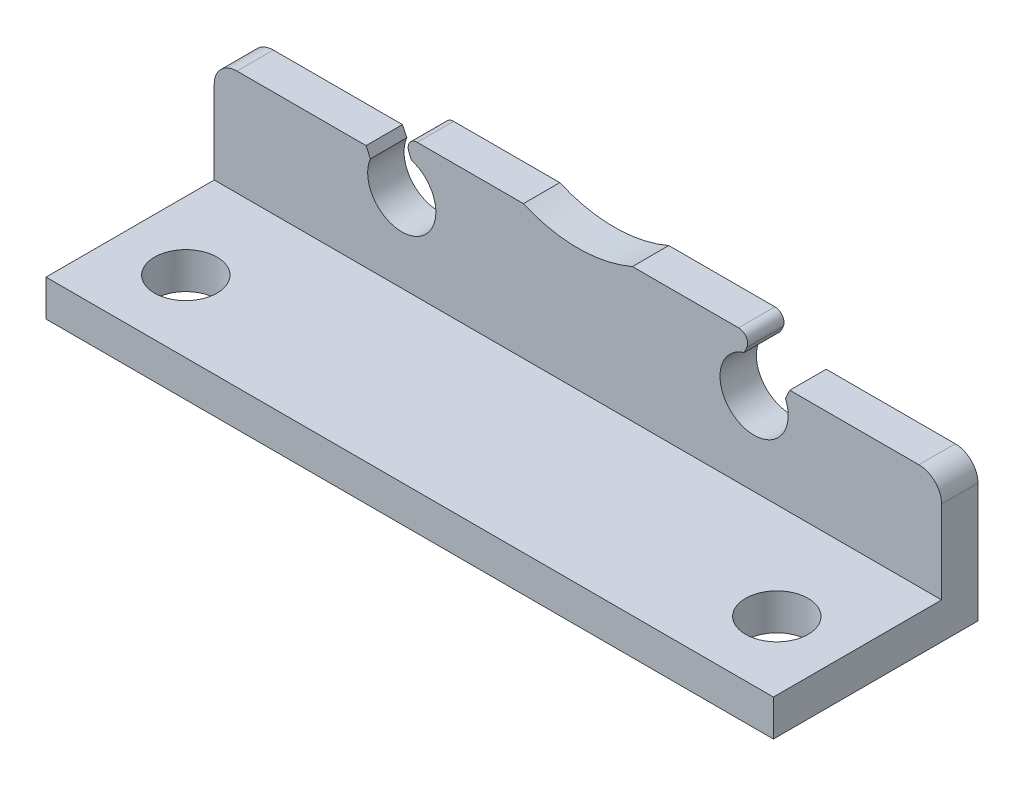
ISO-10303-21;
HEADER;
FILE_DESCRIPTION(('STEP AP214'),'2;1');
FILE_NAME('part.step','',(''),(''),'','','');
FILE_SCHEMA(('AUTOMOTIVE_DESIGN { 1 0 10303 214 1 1 1 1 }'));
ENDSEC;
DATA;
#1=APPLICATION_CONTEXT('core data for automotive mechanical design processes');
#2=APPLICATION_PROTOCOL_DEFINITION('international standard','automotive_design',2000,#1);
#3=PRODUCT_CONTEXT('',#1,'mechanical');
#4=PRODUCT('Part','Part','',(#3));
#5=PRODUCT_RELATED_PRODUCT_CATEGORY('part','',(#4));
#6=PRODUCT_DEFINITION_FORMATION('','',#4);
#7=PRODUCT_DEFINITION_CONTEXT('part definition',#1,'design');
#8=PRODUCT_DEFINITION('design','',#6,#7);
#9=PRODUCT_DEFINITION_SHAPE('','',#8);
#10=(LENGTH_UNIT() NAMED_UNIT(*) SI_UNIT(.MILLI.,.METRE.));
#11=(NAMED_UNIT(*) PLANE_ANGLE_UNIT() SI_UNIT($,.RADIAN.));
#12=(NAMED_UNIT(*) SI_UNIT($,.STERADIAN.) SOLID_ANGLE_UNIT());
#13=UNCERTAINTY_MEASURE_WITH_UNIT(LENGTH_MEASURE(1.E-05),#10,'distance_accuracy_value','');
#14=(GEOMETRIC_REPRESENTATION_CONTEXT(3) GLOBAL_UNCERTAINTY_ASSIGNED_CONTEXT((#13)) GLOBAL_UNIT_ASSIGNED_CONTEXT((#10,
#11,#12)) REPRESENTATION_CONTEXT('',''));
#15=CARTESIAN_POINT('',(0.,0.,0.));
#16=DIRECTION('',(0.,0.,1.));
#17=DIRECTION('',(1.,0.,0.));
#18=AXIS2_PLACEMENT_3D('',#15,#16,#17);
#19=CARTESIAN_POINT('',(-32.0000000000003,0.,0.));
#20=DIRECTION('',(0.,0.,-1.));
#21=DIRECTION('',(0.,1.,0.));
#22=AXIS2_PLACEMENT_3D('',#19,#20,#21);
#23=PLANE('',#22);
#24=DIRECTION('',(0.,1.,0.));
#25=VECTOR('',#24,1.);
#26=CARTESIAN_POINT('',(-32.,0.,0.));
#27=LINE('',#26,#25);
#28=CARTESIAN_POINT('',(-32.,0.,0.));
#29=VERTEX_POINT('',#28);
#30=CARTESIAN_POINT('',(-32.0000000000001,10.4999999999997,0.));
#31=VERTEX_POINT('',#30);
#32=EDGE_CURVE('E166',#29,#31,#27,.T.);
#33=ORIENTED_EDGE('',*,*,#32,.T.);
#34=CARTESIAN_POINT('',(-30.,10.4999999999997,0.));
#35=DIRECTION('',(0.,0.,-1.));
#36=DIRECTION('',(-1.,0.,0.));
#37=AXIS2_PLACEMENT_3D('',#34,#35,#36);
#38=CIRCLE('',#37,2.00000000000033);
#39=CARTESIAN_POINT('',(-30.,12.5,0.));
#40=VERTEX_POINT('',#39);
#41=EDGE_CURVE('E155',#40,#31,#38,.F.);
#42=ORIENTED_EDGE('',*,*,#41,.F.);
#43=DIRECTION('',(1.,0.,0.));
#44=VECTOR('',#43,1.);
#45=CARTESIAN_POINT('',(-30.,12.5,0.));
#46=LINE('',#45,#44);
#47=CARTESIAN_POINT('',(-18.639371154235,12.5,0.));
#48=VERTEX_POINT('',#47);
#49=EDGE_CURVE('E165',#40,#48,#46,.T.);
#50=ORIENTED_EDGE('',*,*,#49,.T.);
#51=DIRECTION('',(0.422618261741008,-0.906307787036506,0.));
#52=VECTOR('',#51,1.);
#53=CARTESIAN_POINT('',(-18.639371154235,12.5,0.));
#54=LINE('',#53,#52);
#55=CARTESIAN_POINT('',(-18.257618735858,11.68132929687,0.));
#56=VERTEX_POINT('',#55);
#57=EDGE_CURVE('E188',#48,#56,#54,.T.);
#58=ORIENTED_EDGE('',*,*,#57,.T.);
#59=CARTESIAN_POINT('',(-15.4999999999997,10.5000000000001,0.));
#60=DIRECTION('',(0.,0.,1.));
#61=DIRECTION('',(0.422618243400283,-0.906307795588926,0.));
#62=AXIS2_PLACEMENT_3D('',#59,#60,#61);
#63=CIRCLE('',#62,2.99999999999994);
#64=CARTESIAN_POINT('',(-14.632387587712,13.371802343833,0.));
#65=VERTEX_POINT('',#64);
#66=EDGE_CURVE('E193',#56,#65,#63,.T.);
#67=ORIENTED_EDGE('',*,*,#66,.T.);
#68=DIRECTION('',(-0.422618261740996,0.906307787036511,0.));
#69=VECTOR('',#68,1.);
#70=CARTESIAN_POINT('',(-14.632387587712,13.371802343833,0.));
#71=LINE('',#70,#69);
#72=CARTESIAN_POINT('',(-14.860926391708,13.861905390607,0.));
#73=VERTEX_POINT('',#72);
#74=EDGE_CURVE('E198',#65,#73,#71,.T.);
#75=ORIENTED_EDGE('',*,*,#74,.T.);
#76=CARTESIAN_POINT('',(-14.1358801620781,14.1999999999995,0.));
#77=DIRECTION('',(0.,0.,-1.));
#78=DIRECTION('',(-0.906307787036791,-0.422618261740397,0.));
#79=AXIS2_PLACEMENT_3D('',#76,#77,#78);
#80=CIRCLE('',#79,0.800000000000477);
#81=CARTESIAN_POINT('',(-14.135880162079,15.,0.));
#82=VERTEX_POINT('',#81);
#83=EDGE_CURVE('E203',#82,#73,#80,.F.);
#84=ORIENTED_EDGE('',*,*,#83,.F.);
#85=DIRECTION('',(1.,0.,0.));
#86=VECTOR('',#85,1.);
#87=CARTESIAN_POINT('',(-14.135880162079,15.,0.));
#88=LINE('',#87,#86);
#89=CARTESIAN_POINT('',(-4.79583152331271,15.,0.));
#90=VERTEX_POINT('',#89);
#91=EDGE_CURVE('E208',#90,#82,#88,.F.);
#92=ORIENTED_EDGE('',*,*,#91,.F.);
#93=CARTESIAN_POINT('',(0.,26.,0.));
#94=DIRECTION('',(0.,0.,1.));
#95=DIRECTION('',(-0.399652626942726,-0.916666666666667,0.));
#96=AXIS2_PLACEMENT_3D('',#93,#94,#95);
#97=CIRCLE('',#96,12.);
#98=CARTESIAN_POINT('',(4.7958315233127,15.,0.));
#99=VERTEX_POINT('',#98);
#100=EDGE_CURVE('E213',#90,#99,#97,.T.);
#101=ORIENTED_EDGE('',*,*,#100,.T.);
#102=DIRECTION('',(1.,0.,0.));
#103=VECTOR('',#102,1.);
#104=CARTESIAN_POINT('',(4.79583152331269,15.,0.));
#105=LINE('',#104,#103);
#106=CARTESIAN_POINT('',(14.135880162079,15.,0.));
#107=VERTEX_POINT('',#106);
#108=EDGE_CURVE('E218',#107,#99,#105,.F.);
#109=ORIENTED_EDGE('',*,*,#108,.F.);
#110=CARTESIAN_POINT('',(14.1358801620781,14.1999999999995,0.));
#111=DIRECTION('',(0.,0.,-1.));
#112=DIRECTION('',(1.05249142734402E-12,1.,0.));
#113=AXIS2_PLACEMENT_3D('',#110,#111,#112);
#114=CIRCLE('',#113,0.800000000000477);
#115=CARTESIAN_POINT('',(14.860926391708,13.861905390607,0.));
#116=VERTEX_POINT('',#115);
#117=EDGE_CURVE('E223',#116,#107,#114,.F.);
#118=ORIENTED_EDGE('',*,*,#117,.F.);
#119=DIRECTION('',(-0.422618261740965,-0.906307787036526,0.));
#120=VECTOR('',#119,1.);
#121=CARTESIAN_POINT('',(14.860926391708,13.861905390607,0.));
#122=LINE('',#121,#120);
#123=CARTESIAN_POINT('',(14.632387587712,13.371802343833,0.));
#124=VERTEX_POINT('',#123);
#125=EDGE_CURVE('E227',#116,#124,#122,.T.);
#126=ORIENTED_EDGE('',*,*,#125,.T.);
#127=CARTESIAN_POINT('',(15.4999999999997,10.5000000000001,0.));
#128=DIRECTION('',(0.,0.,1.));
#129=DIRECTION('',(-0.422618267830387,-0.906307784196982,0.));
#130=AXIS2_PLACEMENT_3D('',#127,#128,#129);
#131=CIRCLE('',#130,2.99999999999994);
#132=CARTESIAN_POINT('',(18.257618735858,11.68132929687,0.));
#133=VERTEX_POINT('',#132);
#134=EDGE_CURVE('E232',#124,#133,#131,.T.);
#135=ORIENTED_EDGE('',*,*,#134,.T.);
#136=DIRECTION('',(0.422618261741011,0.906307787036504,0.));
#137=VECTOR('',#136,1.);
#138=CARTESIAN_POINT('',(18.257618735858,11.68132929687,0.));
#139=LINE('',#138,#137);
#140=CARTESIAN_POINT('',(18.639371154235,12.5,0.));
#141=VERTEX_POINT('',#140);
#142=EDGE_CURVE('E237',#133,#141,#139,.T.);
#143=ORIENTED_EDGE('',*,*,#142,.T.);
#144=DIRECTION('',(1.,0.,0.));
#145=VECTOR('',#144,1.);
#146=CARTESIAN_POINT('',(18.639371154235,12.5,0.));
#147=LINE('',#146,#145);
#148=CARTESIAN_POINT('',(30.,12.5,0.));
#149=VERTEX_POINT('',#148);
#150=EDGE_CURVE('E242',#141,#149,#147,.T.);
#151=ORIENTED_EDGE('',*,*,#150,.T.);
#152=CARTESIAN_POINT('',(30.,10.4999999999997,0.));
#153=DIRECTION('',(0.,0.,-1.));
#154=DIRECTION('',(0.,1.,0.));
#155=AXIS2_PLACEMENT_3D('',#152,#153,#154);
#156=CIRCLE('',#155,2.00000000000033);
#157=CARTESIAN_POINT('',(32.0000000000003,10.4999999999999,0.));
#158=VERTEX_POINT('',#157);
#159=EDGE_CURVE('E247',#158,#149,#156,.F.);
#160=ORIENTED_EDGE('',*,*,#159,.F.);
#161=DIRECTION('',(0.,-1.,0.));
#162=VECTOR('',#161,1.);
#163=CARTESIAN_POINT('',(32.0000000000003,10.4999999999999,0.));
#164=LINE('',#163,#162);
#165=CARTESIAN_POINT('',(32.,0.,0.));
#166=VERTEX_POINT('',#165);
#167=EDGE_CURVE('E252',#166,#158,#164,.F.);
#168=ORIENTED_EDGE('',*,*,#167,.F.);
#169=DIRECTION('',(-1.,0.,0.));
#170=VECTOR('',#169,1.);
#171=CARTESIAN_POINT('',(32.,0.,0.));
#172=LINE('',#171,#170);
#173=EDGE_CURVE('E180',#166,#29,#172,.T.);
#174=ORIENTED_EDGE('',*,*,#173,.T.);
#175=EDGE_LOOP('',(#33,#42,#50,#58,#67,#75,#84,#92,#101,#109,#118,#126,#135,#143,#151,#160,#168,#174));
#176=FACE_BOUND('',#175,.T.);
#177=ADVANCED_FACE('F17',(#176),#23,.T.);
#178=CARTESIAN_POINT('',(-14.135880162079,15.,3.2));
#179=DIRECTION('',(0.,1.,0.));
#180=DIRECTION('',(1.,0.,0.));
#181=AXIS2_PLACEMENT_3D('',#178,#179,#180);
#182=PLANE('',#181);
#183=ORIENTED_EDGE('',*,*,#91,.T.);
#184=DIRECTION('',(0.,0.,1.));
#185=VECTOR('',#184,1.);
#186=CARTESIAN_POINT('',(-14.135880162079,15.,0.));
#187=LINE('',#186,#185);
#188=CARTESIAN_POINT('',(-14.135880162079,15.,3.2));
#189=VERTEX_POINT('',#188);
#190=EDGE_CURVE('E260',#189,#82,#187,.F.);
#191=ORIENTED_EDGE('',*,*,#190,.F.);
#192=DIRECTION('',(1.,0.,0.));
#193=VECTOR('',#192,1.);
#194=CARTESIAN_POINT('',(-14.135880162079,15.,3.2));
#195=LINE('',#194,#193);
#196=CARTESIAN_POINT('',(-4.7958315233127,15.,3.2));
#197=VERTEX_POINT('',#196);
#198=EDGE_CURVE('E264',#197,#189,#195,.F.);
#199=ORIENTED_EDGE('',*,*,#198,.F.);
#200=DIRECTION('',(0.,0.,-1.));
#201=VECTOR('',#200,1.);
#202=CARTESIAN_POINT('',(-4.7958315233127,15.,3.2));
#203=LINE('',#202,#201);
#204=EDGE_CURVE('E269',#197,#90,#203,.T.);
#205=ORIENTED_EDGE('',*,*,#204,.T.);
#206=EDGE_LOOP('',(#183,#191,#199,#205));
#207=FACE_BOUND('',#206,.T.);
#208=ADVANCED_FACE('F505',(#207),#182,.T.);
#209=CARTESIAN_POINT('',(4.7958315233127,15.,3.2));
#210=DIRECTION('',(0.,1.,0.));
#211=DIRECTION('',(1.,0.,0.));
#212=AXIS2_PLACEMENT_3D('',#209,#210,#211);
#213=PLANE('',#212);
#214=DIRECTION('',(0.,0.,1.));
#215=VECTOR('',#214,1.);
#216=CARTESIAN_POINT('',(4.7958315233127,15.,0.));
#217=LINE('',#216,#215);
#218=CARTESIAN_POINT('',(4.79583152331271,15.,3.2));
#219=VERTEX_POINT('',#218);
#220=EDGE_CURVE('E274',#219,#99,#217,.F.);
#221=ORIENTED_EDGE('',*,*,#220,.F.);
#222=DIRECTION('',(1.,0.,0.));
#223=VECTOR('',#222,1.);
#224=CARTESIAN_POINT('',(4.79583152331271,15.,3.2));
#225=LINE('',#224,#223);
#226=CARTESIAN_POINT('',(14.135880162079,15.,3.2));
#227=VERTEX_POINT('',#226);
#228=EDGE_CURVE('E278',#227,#219,#225,.F.);
#229=ORIENTED_EDGE('',*,*,#228,.F.);
#230=DIRECTION('',(0.,0.,-1.));
#231=VECTOR('',#230,1.);
#232=CARTESIAN_POINT('',(14.135880162079,15.,3.2));
#233=LINE('',#232,#231);
#234=EDGE_CURVE('E283',#227,#107,#233,.T.);
#235=ORIENTED_EDGE('',*,*,#234,.T.);
#236=ORIENTED_EDGE('',*,*,#108,.T.);
#237=EDGE_LOOP('',(#221,#229,#235,#236));
#238=FACE_BOUND('',#237,.T.);
#239=ADVANCED_FACE('F510',(#238),#213,.T.);
#240=CARTESIAN_POINT('',(32.0000000000003,3.2,3.2));
#241=DIRECTION('',(0.,0.,1.));
#242=DIRECTION('',(0.,1.,0.));
#243=AXIS2_PLACEMENT_3D('',#240,#241,#242);
#244=PLANE('',#243);
#245=DIRECTION('',(-1.,0.,0.));
#246=VECTOR('',#245,1.);
#247=CARTESIAN_POINT('',(-18.639371154235,12.5,3.2));
#248=LINE('',#247,#246);
#249=CARTESIAN_POINT('',(-30.,12.5,3.2));
#250=VERTEX_POINT('',#249);
#251=CARTESIAN_POINT('',(-18.639371154235,12.5,3.2));
#252=VERTEX_POINT('',#251);
#253=EDGE_CURVE('E288',#250,#252,#248,.F.);
#254=ORIENTED_EDGE('',*,*,#253,.F.);
#255=CARTESIAN_POINT('',(-30.,10.4999999999997,3.2));
#256=DIRECTION('',(0.,0.,1.));
#257=DIRECTION('',(0.,1.,0.));
#258=AXIS2_PLACEMENT_3D('',#255,#256,#257);
#259=CIRCLE('',#258,2.00000000000033);
#260=CARTESIAN_POINT('',(-32.0000000000003,10.4999999999998,3.2));
#261=VERTEX_POINT('',#260);
#262=EDGE_CURVE('E292',#250,#261,#259,.T.);
#263=ORIENTED_EDGE('',*,*,#262,.T.);
#264=DIRECTION('',(0.,-1.,0.));
#265=VECTOR('',#264,1.);
#266=CARTESIAN_POINT('',(-32.0000000000003,10.4999999999998,3.2));
#267=LINE('',#266,#265);
#268=CARTESIAN_POINT('',(-32.,3.2,3.2));
#269=VERTEX_POINT('',#268);
#270=EDGE_CURVE('E174',#261,#269,#267,.T.);
#271=ORIENTED_EDGE('',*,*,#270,.T.);
#272=DIRECTION('',(1.,0.,0.));
#273=VECTOR('',#272,1.);
#274=CARTESIAN_POINT('',(-32.,3.2,3.2));
#275=LINE('',#274,#273);
#276=CARTESIAN_POINT('',(32.,3.2,3.2));
#277=VERTEX_POINT('',#276);
#278=EDGE_CURVE('E299',#277,#269,#275,.F.);
#279=ORIENTED_EDGE('',*,*,#278,.F.);
#280=DIRECTION('',(0.,1.,0.));
#281=VECTOR('',#280,1.);
#282=CARTESIAN_POINT('',(32.,3.2,3.2));
#283=LINE('',#282,#281);
#284=CARTESIAN_POINT('',(32.,10.4999999999997,3.2));
#285=VERTEX_POINT('',#284);
#286=EDGE_CURVE('E303',#285,#277,#283,.F.);
#287=ORIENTED_EDGE('',*,*,#286,.F.);
#288=CARTESIAN_POINT('',(30.,10.4999999999997,3.2));
#289=DIRECTION('',(0.,0.,1.));
#290=DIRECTION('',(1.,0.,0.));
#291=AXIS2_PLACEMENT_3D('',#288,#289,#290);
#292=CIRCLE('',#291,2.00000000000033);
#293=CARTESIAN_POINT('',(30.,12.5,3.2));
#294=VERTEX_POINT('',#293);
#295=EDGE_CURVE('E308',#285,#294,#292,.T.);
#296=ORIENTED_EDGE('',*,*,#295,.T.);
#297=DIRECTION('',(-1.,0.,0.));
#298=VECTOR('',#297,1.);
#299=CARTESIAN_POINT('',(30.,12.5,3.2));
#300=LINE('',#299,#298);
#301=CARTESIAN_POINT('',(18.639371154235,12.5,3.2));
#302=VERTEX_POINT('',#301);
#303=EDGE_CURVE('E313',#302,#294,#300,.F.);
#304=ORIENTED_EDGE('',*,*,#303,.F.);
#305=DIRECTION('',(-0.422618261741015,-0.906307787036503,0.));
#306=VECTOR('',#305,1.);
#307=CARTESIAN_POINT('',(18.639371154235,12.5,3.2));
#308=LINE('',#307,#306);
#309=CARTESIAN_POINT('',(18.257618735858,11.68132929687,3.2));
#310=VERTEX_POINT('',#309);
#311=EDGE_CURVE('E317',#310,#302,#308,.F.);
#312=ORIENTED_EDGE('',*,*,#311,.F.);
#313=CARTESIAN_POINT('',(15.4999999999997,10.5000000000001,3.2));
#314=DIRECTION('',(0.,0.,-1.));
#315=DIRECTION('',(-0.42261824384956,-0.906307795379425,0.));
#316=AXIS2_PLACEMENT_3D('',#313,#314,#315);
#317=CIRCLE('',#316,2.99999999999994);
#318=CARTESIAN_POINT('',(14.632387587712,13.371802343833,3.2));
#319=VERTEX_POINT('',#318);
#320=EDGE_CURVE('E321',#319,#310,#317,.F.);
#321=ORIENTED_EDGE('',*,*,#320,.F.);
#322=DIRECTION('',(0.422618261740995,0.906307787036512,0.));
#323=VECTOR('',#322,1.);
#324=CARTESIAN_POINT('',(14.632387587712,13.371802343833,3.2));
#325=LINE('',#324,#323);
#326=CARTESIAN_POINT('',(14.860926391708,13.861905390607,3.2));
#327=VERTEX_POINT('',#326);
#328=EDGE_CURVE('E325',#327,#319,#325,.F.);
#329=ORIENTED_EDGE('',*,*,#328,.F.);
#330=CARTESIAN_POINT('',(14.1358801620781,14.1999999999995,3.2));
#331=DIRECTION('',(0.,0.,1.));
#332=DIRECTION('',(0.906307787036791,-0.422618261740397,0.));
#333=AXIS2_PLACEMENT_3D('',#330,#331,#332);
#334=CIRCLE('',#333,0.800000000000477);
#335=EDGE_CURVE('E329',#327,#227,#334,.T.);
#336=ORIENTED_EDGE('',*,*,#335,.T.);
#337=ORIENTED_EDGE('',*,*,#228,.T.);
#338=CARTESIAN_POINT('',(0.,26.,3.2));
#339=DIRECTION('',(0.,0.,-1.));
#340=DIRECTION('',(0.399652626942726,-0.916666666666667,0.));
#341=AXIS2_PLACEMENT_3D('',#338,#339,#340);
#342=CIRCLE('',#341,12.);
#343=EDGE_CURVE('E334',#197,#219,#342,.F.);
#344=ORIENTED_EDGE('',*,*,#343,.F.);
#345=ORIENTED_EDGE('',*,*,#198,.T.);
#346=CARTESIAN_POINT('',(-14.1358801620781,14.1999999999995,3.2));
#347=DIRECTION('',(0.,0.,1.));
#348=DIRECTION('',(-1.05249142734402E-12,1.,0.));
#349=AXIS2_PLACEMENT_3D('',#346,#347,#348);
#350=CIRCLE('',#349,0.800000000000477);
#351=CARTESIAN_POINT('',(-14.860926391708,13.861905390607,3.2));
#352=VERTEX_POINT('',#351);
#353=EDGE_CURVE('E338',#189,#352,#350,.T.);
#354=ORIENTED_EDGE('',*,*,#353,.T.);
#355=DIRECTION('',(0.422618261740979,-0.90630778703652,0.));
#356=VECTOR('',#355,1.);
#357=CARTESIAN_POINT('',(-14.860926391708,13.861905390607,3.2));
#358=LINE('',#357,#356);
#359=CARTESIAN_POINT('',(-14.632387587712,13.371802343833,3.2));
#360=VERTEX_POINT('',#359);
#361=EDGE_CURVE('E343',#360,#352,#358,.F.);
#362=ORIENTED_EDGE('',*,*,#361,.F.);
#363=CARTESIAN_POINT('',(-15.4999999999997,10.5000000000001,3.2));
#364=DIRECTION('',(0.,0.,-1.));
#365=DIRECTION('',(0.42261824700528,-0.906307793907889,0.));
#366=AXIS2_PLACEMENT_3D('',#363,#364,#365);
#367=CIRCLE('',#366,2.99999999999994);
#368=CARTESIAN_POINT('',(-18.257618735858,11.68132929687,3.2));
#369=VERTEX_POINT('',#368);
#370=EDGE_CURVE('E347',#369,#360,#367,.F.);
#371=ORIENTED_EDGE('',*,*,#370,.F.);
#372=DIRECTION('',(-0.422618261741011,0.906307787036504,0.));
#373=VECTOR('',#372,1.);
#374=CARTESIAN_POINT('',(-18.257618735858,11.68132929687,3.2));
#375=LINE('',#374,#373);
#376=EDGE_CURVE('E351',#252,#369,#375,.F.);
#377=ORIENTED_EDGE('',*,*,#376,.F.);
#378=EDGE_LOOP('',(#254,#263,#271,#279,#287,#296,#304,#312,#321,#329,#336,#337,#344,#345,#354,
#362,#371,#377));
#379=FACE_BOUND('',#378,.T.);
#380=ADVANCED_FACE('F461',(#379),#244,.T.);
#381=CARTESIAN_POINT('',(32.,0.,18.));
#382=DIRECTION('',(1.,0.,0.));
#383=DIRECTION('',(0.,0.,-1.));
#384=AXIS2_PLACEMENT_3D('',#381,#382,#383);
#385=PLANE('',#384);
#386=ORIENTED_EDGE('',*,*,#167,.T.);
#387=DIRECTION('',(0.,0.,1.));
#388=VECTOR('',#387,1.);
#389=CARTESIAN_POINT('',(32.,10.4999999999999,0.));
#390=LINE('',#389,#388);
#391=EDGE_CURVE('E355',#285,#158,#390,.F.);
#392=ORIENTED_EDGE('',*,*,#391,.F.);
#393=ORIENTED_EDGE('',*,*,#286,.T.);
#394=DIRECTION('',(0.,0.,1.));
#395=VECTOR('',#394,1.);
#396=CARTESIAN_POINT('',(32.,3.2,3.2));
#397=LINE('',#396,#395);
#398=CARTESIAN_POINT('',(32.,3.2,18.));
#399=VERTEX_POINT('',#398);
#400=EDGE_CURVE('E359',#277,#399,#397,.T.);
#401=ORIENTED_EDGE('',*,*,#400,.T.);
#402=DIRECTION('',(0.,-1.,0.));
#403=VECTOR('',#402,1.);
#404=CARTESIAN_POINT('',(32.,3.2,18.));
#405=LINE('',#404,#403);
#406=CARTESIAN_POINT('',(32.,0.,18.));
#407=VERTEX_POINT('',#406);
#408=EDGE_CURVE('E364',#399,#407,#405,.T.);
#409=ORIENTED_EDGE('',*,*,#408,.T.);
#410=DIRECTION('',(0.,0.,-1.));
#411=VECTOR('',#410,1.);
#412=CARTESIAN_POINT('',(32.,0.,18.));
#413=LINE('',#412,#411);
#414=EDGE_CURVE('E176',#407,#166,#413,.T.);
#415=ORIENTED_EDGE('',*,*,#414,.T.);
#416=EDGE_LOOP('',(#386,#392,#393,#401,#409,#415));
#417=FACE_BOUND('',#416,.T.);
#418=ADVANCED_FACE('F472',(#417),#385,.T.);
#419=CARTESIAN_POINT('',(-32.,0.,18.));
#420=DIRECTION('',(-1.,0.,0.));
#421=DIRECTION('',(0.,1.,0.));
#422=AXIS2_PLACEMENT_3D('',#419,#420,#421);
#423=PLANE('',#422);
#424=DIRECTION('',(0.,0.,-1.));
#425=VECTOR('',#424,1.);
#426=CARTESIAN_POINT('',(-32.,10.4999999999998,3.2));
#427=LINE('',#426,#425);
#428=EDGE_CURVE('E159',#261,#31,#427,.T.);
#429=ORIENTED_EDGE('',*,*,#428,.T.);
#430=ORIENTED_EDGE('',*,*,#32,.F.);
#431=DIRECTION('',(0.,0.,1.));
#432=VECTOR('',#431,1.);
#433=CARTESIAN_POINT('',(-32.,0.,0.));
#434=LINE('',#433,#432);
#435=CARTESIAN_POINT('',(-32.,0.,18.));
#436=VERTEX_POINT('',#435);
#437=EDGE_CURVE('E175',#436,#29,#434,.F.);
#438=ORIENTED_EDGE('',*,*,#437,.F.);
#439=DIRECTION('',(0.,1.,0.));
#440=VECTOR('',#439,1.);
#441=CARTESIAN_POINT('',(-32.,0.,18.));
#442=LINE('',#441,#440);
#443=CARTESIAN_POINT('',(-32.,3.2,18.));
#444=VERTEX_POINT('',#443);
#445=EDGE_CURVE('E378',#444,#436,#442,.F.);
#446=ORIENTED_EDGE('',*,*,#445,.F.);
#447=DIRECTION('',(0.,0.,-1.));
#448=VECTOR('',#447,1.);
#449=CARTESIAN_POINT('',(-32.,3.2,18.));
#450=LINE('',#449,#448);
#451=EDGE_CURVE('E382',#269,#444,#450,.F.);
#452=ORIENTED_EDGE('',*,*,#451,.F.);
#453=ORIENTED_EDGE('',*,*,#270,.F.);
#454=EDGE_LOOP('',(#429,#430,#438,#446,#452,#453));
#455=FACE_BOUND('',#454,.T.);
#456=ADVANCED_FACE('F171',(#455),#423,.T.);
#457=CARTESIAN_POINT('',(-32.,3.2,18.));
#458=DIRECTION('',(0.,1.,0.));
#459=DIRECTION('',(1.,0.,0.));
#460=AXIS2_PLACEMENT_3D('',#457,#458,#459);
#461=PLANE('',#460);
#462=ORIENTED_EDGE('',*,*,#451,.T.);
#463=DIRECTION('',(1.,0.,0.));
#464=VECTOR('',#463,1.);
#465=CARTESIAN_POINT('',(-32.,3.2,18.));
#466=LINE('',#465,#464);
#467=EDGE_CURVE('E33',#399,#444,#466,.F.);
#468=ORIENTED_EDGE('',*,*,#467,.F.);
#469=ORIENTED_EDGE('',*,*,#400,.F.);
#470=ORIENTED_EDGE('',*,*,#278,.T.);
#471=EDGE_LOOP('',(#462,#468,#469,#470));
#472=FACE_BOUND('',#471,.T.);
#473=CARTESIAN_POINT('',(-26.,3.2,11.7));
#474=DIRECTION('',(0.,-1.,0.));
#475=DIRECTION('',(1.42051243818227E-07,0.,0.99999999999999));
#476=AXIS2_PLACEMENT_3D('',#473,#474,#475);
#477=CIRCLE('',#476,2.75);
#478=CARTESIAN_POINT('',(-25.9999996093591,3.2,14.45));
#479=VERTEX_POINT('',#478);
#480=EDGE_CURVE('E390',#479,#479,#477,.F.);
#481=ORIENTED_EDGE('',*,*,#480,.F.);
#482=EDGE_LOOP('',(#481));
#483=FACE_BOUND('',#482,.T.);
#484=CARTESIAN_POINT('',(26.,3.2,11.7));
#485=DIRECTION('',(0.,-1.,0.));
#486=DIRECTION('',(1.42051171472058E-07,0.,0.99999999999999));
#487=AXIS2_PLACEMENT_3D('',#484,#485,#486);
#488=CIRCLE('',#487,2.75);
#489=CARTESIAN_POINT('',(26.0000003906407,3.2,14.45));
#490=VERTEX_POINT('',#489);
#491=EDGE_CURVE('E395',#490,#490,#488,.F.);
#492=ORIENTED_EDGE('',*,*,#491,.F.);
#493=EDGE_LOOP('',(#492));
#494=FACE_BOUND('',#493,.T.);
#495=ADVANCED_FACE('F477',(#472,#483,#494),#461,.T.);
#496=CARTESIAN_POINT('',(32.,0.,18.));
#497=DIRECTION('',(0.,0.,1.));
#498=DIRECTION('',(0.,1.,0.));
#499=AXIS2_PLACEMENT_3D('',#496,#497,#498);
#500=PLANE('',#499);
#501=ORIENTED_EDGE('',*,*,#445,.T.);
#502=DIRECTION('',(1.,0.,0.));
#503=VECTOR('',#502,1.);
#504=CARTESIAN_POINT('',(-32.,0.,18.));
#505=LINE('',#504,#503);
#506=EDGE_CURVE('E41',#407,#436,#505,.F.);
#507=ORIENTED_EDGE('',*,*,#506,.F.);
#508=ORIENTED_EDGE('',*,*,#408,.F.);
#509=ORIENTED_EDGE('',*,*,#467,.T.);
#510=EDGE_LOOP('',(#501,#507,#508,#509));
#511=FACE_BOUND('',#510,.T.);
#512=ADVANCED_FACE('F475',(#511),#500,.T.);
#513=CARTESIAN_POINT('',(-32.,0.,0.));
#514=DIRECTION('',(0.,-1.,0.));
#515=DIRECTION('',(1.,0.,0.));
#516=AXIS2_PLACEMENT_3D('',#513,#514,#515);
#517=PLANE('',#516);
#518=ORIENTED_EDGE('',*,*,#437,.T.);
#519=ORIENTED_EDGE('',*,*,#173,.F.);
#520=ORIENTED_EDGE('',*,*,#414,.F.);
#521=ORIENTED_EDGE('',*,*,#506,.T.);
#522=EDGE_LOOP('',(#518,#519,#520,#521));
#523=FACE_BOUND('',#522,.T.);
#524=CARTESIAN_POINT('',(-26.,0.,11.7));
#525=DIRECTION('',(0.,1.,0.));
#526=DIRECTION('',(0.,0.,-1.));
#527=AXIS2_PLACEMENT_3D('',#524,#525,#526);
#528=CIRCLE('',#527,2.75);
#529=CARTESIAN_POINT('',(-26.,0.,8.95));
#530=VERTEX_POINT('',#529);
#531=EDGE_CURVE('E399',#530,#530,#528,.T.);
#532=ORIENTED_EDGE('',*,*,#531,.T.);
#533=EDGE_LOOP('',(#532));
#534=FACE_BOUND('',#533,.T.);
#535=CARTESIAN_POINT('',(26.,0.,11.7));
#536=DIRECTION('',(0.,1.,0.));
#537=DIRECTION('',(0.,0.,-1.));
#538=AXIS2_PLACEMENT_3D('',#535,#536,#537);
#539=CIRCLE('',#538,2.75);
#540=CARTESIAN_POINT('',(26.,0.,8.95));
#541=VERTEX_POINT('',#540);
#542=EDGE_CURVE('E404',#541,#541,#539,.T.);
#543=ORIENTED_EDGE('',*,*,#542,.T.);
#544=EDGE_LOOP('',(#543));
#545=FACE_BOUND('',#544,.T.);
#546=ADVANCED_FACE('F473',(#523,#534,#545),#517,.T.);
#547=CARTESIAN_POINT('',(-14.1358801620781,14.1999999999995,18.));
#548=DIRECTION('',(0.,0.,-1.));
#549=DIRECTION('',(-0.906307787036789,-0.422618261740401,0.));
#550=AXIS2_PLACEMENT_3D('',#547,#548,#549);
#551=CYLINDRICAL_SURFACE('',#550,0.800000000000477);
#552=ORIENTED_EDGE('',*,*,#190,.T.);
#553=ORIENTED_EDGE('',*,*,#83,.T.);
#554=DIRECTION('',(0.,0.,1.));
#555=VECTOR('',#554,1.);
#556=CARTESIAN_POINT('',(-14.860926391708,13.861905390607,0.));
#557=LINE('',#556,#555);
#558=EDGE_CURVE('E407',#352,#73,#557,.F.);
#559=ORIENTED_EDGE('',*,*,#558,.F.);
#560=ORIENTED_EDGE('',*,*,#353,.F.);
#561=EDGE_LOOP('',(#552,#553,#559,#560));
#562=FACE_BOUND('',#561,.T.);
#563=ADVANCED_FACE('F502',(#562),#551,.T.);
#564=CARTESIAN_POINT('',(-14.860926391708,13.861905390607,0.));
#565=DIRECTION('',(-0.906307787036516,-0.422618261740987,0.));
#566=DIRECTION('',(0.422618261740987,-0.906307787036516,0.));
#567=AXIS2_PLACEMENT_3D('',#564,#565,#566);
#568=PLANE('',#567);
#569=ORIENTED_EDGE('',*,*,#361,.T.);
#570=ORIENTED_EDGE('',*,*,#558,.T.);
#571=ORIENTED_EDGE('',*,*,#74,.F.);
#572=DIRECTION('',(0.,0.,1.));
#573=VECTOR('',#572,1.);
#574=CARTESIAN_POINT('',(-14.632387587712,13.371802343833,0.));
#575=LINE('',#574,#573);
#576=EDGE_CURVE('E409',#360,#65,#575,.F.);
#577=ORIENTED_EDGE('',*,*,#576,.F.);
#578=EDGE_LOOP('',(#569,#570,#571,#577));
#579=FACE_BOUND('',#578,.T.);
#580=ADVANCED_FACE('F496',(#579),#568,.T.);
#581=CARTESIAN_POINT('',(-15.4999999999997,10.5000000000001,18.));
#582=DIRECTION('',(0.,0.,-1.));
#583=DIRECTION('',(0.289204137429255,0.957267447944304,0.));
#584=AXIS2_PLACEMENT_3D('',#581,#582,#583);
#585=CYLINDRICAL_SURFACE('',#584,2.99999999999994);
#586=ORIENTED_EDGE('',*,*,#576,.T.);
#587=ORIENTED_EDGE('',*,*,#66,.F.);
#588=DIRECTION('',(0.,0.,1.));
#589=VECTOR('',#588,1.);
#590=CARTESIAN_POINT('',(-18.257618735858,11.68132929687,0.));
#591=LINE('',#590,#589);
#592=EDGE_CURVE('E413',#369,#56,#591,.F.);
#593=ORIENTED_EDGE('',*,*,#592,.F.);
#594=ORIENTED_EDGE('',*,*,#370,.T.);
#595=EDGE_LOOP('',(#586,#587,#593,#594));
#596=FACE_BOUND('',#595,.T.);
#597=ADVANCED_FACE('F492',(#596),#585,.F.);
#598=CARTESIAN_POINT('',(-18.257618735858,11.68132929687,0.));
#599=DIRECTION('',(0.906307787036503,0.422618261741014,0.));
#600=DIRECTION('',(-0.422618261741014,0.906307787036503,0.));
#601=AXIS2_PLACEMENT_3D('',#598,#599,#600);
#602=PLANE('',#601);
#603=ORIENTED_EDGE('',*,*,#376,.T.);
#604=ORIENTED_EDGE('',*,*,#592,.T.);
#605=ORIENTED_EDGE('',*,*,#57,.F.);
#606=DIRECTION('',(0.,0.,1.));
#607=VECTOR('',#606,1.);
#608=CARTESIAN_POINT('',(-18.639371154235,12.5,0.));
#609=LINE('',#608,#607);
#610=EDGE_CURVE('E417',#252,#48,#609,.F.);
#611=ORIENTED_EDGE('',*,*,#610,.F.);
#612=EDGE_LOOP('',(#603,#604,#605,#611));
#613=FACE_BOUND('',#612,.T.);
#614=ADVANCED_FACE('F487',(#613),#602,.T.);
#615=CARTESIAN_POINT('',(-30.,10.4999999999997,18.));
#616=DIRECTION('',(0.,0.,-1.));
#617=DIRECTION('',(-1.,0.,0.));
#618=AXIS2_PLACEMENT_3D('',#615,#616,#617);
#619=CYLINDRICAL_SURFACE('',#618,2.00000000000033);
#620=DIRECTION('',(0.,0.,-1.));
#621=VECTOR('',#620,1.);
#622=CARTESIAN_POINT('',(-30.,12.5,3.2));
#623=LINE('',#622,#621);
#624=EDGE_CURVE('E161',#250,#40,#623,.T.);
#625=ORIENTED_EDGE('',*,*,#624,.T.);
#626=ORIENTED_EDGE('',*,*,#41,.T.);
#627=ORIENTED_EDGE('',*,*,#428,.F.);
#628=ORIENTED_EDGE('',*,*,#262,.F.);
#629=EDGE_LOOP('',(#625,#626,#627,#628));
#630=FACE_BOUND('',#629,.T.);
#631=ADVANCED_FACE('F157',(#630),#619,.T.);
#632=CARTESIAN_POINT('',(-30.,12.5,0.));
#633=DIRECTION('',(0.,1.,0.));
#634=DIRECTION('',(0.,0.,1.));
#635=AXIS2_PLACEMENT_3D('',#632,#633,#634);
#636=PLANE('',#635);
#637=ORIENTED_EDGE('',*,*,#253,.T.);
#638=ORIENTED_EDGE('',*,*,#610,.T.);
#639=ORIENTED_EDGE('',*,*,#49,.F.);
#640=ORIENTED_EDGE('',*,*,#624,.F.);
#641=EDGE_LOOP('',(#637,#638,#639,#640));
#642=FACE_BOUND('',#641,.T.);
#643=ADVANCED_FACE('F484',(#642),#636,.T.);
#644=CARTESIAN_POINT('',(30.,10.4999999999997,18.));
#645=DIRECTION('',(0.,0.,-1.));
#646=DIRECTION('',(0.,1.,0.));
#647=AXIS2_PLACEMENT_3D('',#644,#645,#646);
#648=CYLINDRICAL_SURFACE('',#647,2.00000000000033);
#649=ORIENTED_EDGE('',*,*,#391,.T.);
#650=ORIENTED_EDGE('',*,*,#159,.T.);
#651=DIRECTION('',(0.,0.,1.));
#652=VECTOR('',#651,1.);
#653=CARTESIAN_POINT('',(30.,12.5,0.));
#654=LINE('',#653,#652);
#655=EDGE_CURVE('E424',#294,#149,#654,.F.);
#656=ORIENTED_EDGE('',*,*,#655,.F.);
#657=ORIENTED_EDGE('',*,*,#295,.F.);
#658=EDGE_LOOP('',(#649,#650,#656,#657));
#659=FACE_BOUND('',#658,.T.);
#660=ADVANCED_FACE('F468',(#659),#648,.T.);
#661=CARTESIAN_POINT('',(18.639371154235,12.5,0.));
#662=DIRECTION('',(0.,1.,0.));
#663=DIRECTION('',(0.,0.,1.));
#664=AXIS2_PLACEMENT_3D('',#661,#662,#663);
#665=PLANE('',#664);
#666=ORIENTED_EDGE('',*,*,#303,.T.);
#667=ORIENTED_EDGE('',*,*,#655,.T.);
#668=ORIENTED_EDGE('',*,*,#150,.F.);
#669=DIRECTION('',(0.,0.,1.));
#670=VECTOR('',#669,1.);
#671=CARTESIAN_POINT('',(18.639371154235,12.5,0.));
#672=LINE('',#671,#670);
#673=EDGE_CURVE('E428',#302,#141,#672,.F.);
#674=ORIENTED_EDGE('',*,*,#673,.F.);
#675=EDGE_LOOP('',(#666,#667,#668,#674));
#676=FACE_BOUND('',#675,.T.);
#677=ADVANCED_FACE('F465',(#676),#665,.T.);
#678=CARTESIAN_POINT('',(18.639371154235,12.5,0.));
#679=DIRECTION('',(-0.906307787036503,0.422618261741014,0.));
#680=DIRECTION('',(-0.422618261741014,-0.906307787036503,0.));
#681=AXIS2_PLACEMENT_3D('',#678,#679,#680);
#682=PLANE('',#681);
#683=ORIENTED_EDGE('',*,*,#311,.T.);
#684=ORIENTED_EDGE('',*,*,#673,.T.);
#685=ORIENTED_EDGE('',*,*,#142,.F.);
#686=DIRECTION('',(0.,0.,1.));
#687=VECTOR('',#686,1.);
#688=CARTESIAN_POINT('',(18.257618735858,11.68132929687,0.));
#689=LINE('',#688,#687);
#690=EDGE_CURVE('E432',#310,#133,#689,.F.);
#691=ORIENTED_EDGE('',*,*,#690,.F.);
#692=EDGE_LOOP('',(#683,#684,#685,#691));
#693=FACE_BOUND('',#692,.T.);
#694=ADVANCED_FACE('F456',(#693),#682,.T.);
#695=CARTESIAN_POINT('',(15.4999999999997,10.5000000000001,18.));
#696=DIRECTION('',(0.,0.,-1.));
#697=DIRECTION('',(0.919206245286109,0.393776432289965,0.));
#698=AXIS2_PLACEMENT_3D('',#695,#696,#697);
#699=CYLINDRICAL_SURFACE('',#698,2.99999999999994);
#700=ORIENTED_EDGE('',*,*,#690,.T.);
#701=ORIENTED_EDGE('',*,*,#134,.F.);
#702=DIRECTION('',(0.,0.,1.));
#703=VECTOR('',#702,1.);
#704=CARTESIAN_POINT('',(14.632387587712,13.371802343833,0.));
#705=LINE('',#704,#703);
#706=EDGE_CURVE('E26',#319,#124,#705,.F.);
#707=ORIENTED_EDGE('',*,*,#706,.F.);
#708=ORIENTED_EDGE('',*,*,#320,.T.);
#709=EDGE_LOOP('',(#700,#701,#707,#708));
#710=FACE_BOUND('',#709,.T.);
#711=ADVANCED_FACE('F452',(#710),#699,.F.);
#712=CARTESIAN_POINT('',(14.632387587712,13.371802343833,0.));
#713=DIRECTION('',(0.906307787036516,-0.422618261740987,0.));
#714=DIRECTION('',(0.422618261740987,0.906307787036516,0.));
#715=AXIS2_PLACEMENT_3D('',#712,#713,#714);
#716=PLANE('',#715);
#717=ORIENTED_EDGE('',*,*,#328,.T.);
#718=ORIENTED_EDGE('',*,*,#706,.T.);
#719=ORIENTED_EDGE('',*,*,#125,.F.);
#720=DIRECTION('',(0.,0.,1.));
#721=VECTOR('',#720,1.);
#722=CARTESIAN_POINT('',(14.860926391708,13.861905390607,0.));
#723=LINE('',#722,#721);
#724=EDGE_CURVE('E11',#327,#116,#723,.F.);
#725=ORIENTED_EDGE('',*,*,#724,.F.);
#726=EDGE_LOOP('',(#717,#718,#719,#725));
#727=FACE_BOUND('',#726,.T.);
#728=ADVANCED_FACE('F443',(#727),#716,.T.);
#729=CARTESIAN_POINT('',(14.1358801620781,14.1999999999995,18.));
#730=DIRECTION('',(0.,0.,-1.));
#731=DIRECTION('',(1.06575287130019E-12,1.,0.));
#732=AXIS2_PLACEMENT_3D('',#729,#730,#731);
#733=CYLINDRICAL_SURFACE('',#732,0.800000000000477);
#734=ORIENTED_EDGE('',*,*,#724,.T.);
#735=ORIENTED_EDGE('',*,*,#117,.T.);
#736=ORIENTED_EDGE('',*,*,#234,.F.);
#737=ORIENTED_EDGE('',*,*,#335,.F.);
#738=EDGE_LOOP('',(#734,#735,#736,#737));
#739=FACE_BOUND('',#738,.T.);
#740=ADVANCED_FACE('F513',(#739),#733,.T.);
#741=CARTESIAN_POINT('',(0.,26.,18.));
#742=DIRECTION('',(0.,0.,-1.));
#743=DIRECTION('',(0.399652626942726,-0.916666666666667,0.));
#744=AXIS2_PLACEMENT_3D('',#741,#742,#743);
#745=CYLINDRICAL_SURFACE('',#744,12.);
#746=ORIENTED_EDGE('',*,*,#343,.T.);
#747=ORIENTED_EDGE('',*,*,#220,.T.);
#748=ORIENTED_EDGE('',*,*,#100,.F.);
#749=ORIENTED_EDGE('',*,*,#204,.F.);
#750=EDGE_LOOP('',(#746,#747,#748,#749));
#751=FACE_BOUND('',#750,.T.);
#752=ADVANCED_FACE('F514',(#751),#745,.F.);
#753=CARTESIAN_POINT('',(-26.,3.2,11.7));
#754=DIRECTION('',(0.,-1.,0.));
#755=DIRECTION('',(1.42053980256913E-07,0.,0.99999999999999));
#756=AXIS2_PLACEMENT_3D('',#753,#754,#755);
#757=CYLINDRICAL_SURFACE('',#756,2.75);
#758=ORIENTED_EDGE('',*,*,#480,.T.);
#759=EDGE_LOOP('',(#758));
#760=FACE_BOUND('',#759,.T.);
#761=ORIENTED_EDGE('',*,*,#531,.F.);
#762=EDGE_LOOP('',(#761));
#763=FACE_BOUND('',#762,.T.);
#764=ADVANCED_FACE('F516',(#760,#763),#757,.F.);
#765=CARTESIAN_POINT('',(26.,3.2,11.7));
#766=DIRECTION('',(0.,-1.,0.));
#767=DIRECTION('',(1.42051172724928E-07,0.,0.99999999999999));
#768=AXIS2_PLACEMENT_3D('',#765,#766,#767);
#769=CYLINDRICAL_SURFACE('',#768,2.75);
#770=ORIENTED_EDGE('',*,*,#491,.T.);
#771=EDGE_LOOP('',(#770));
#772=FACE_BOUND('',#771,.T.);
#773=ORIENTED_EDGE('',*,*,#542,.F.);
#774=EDGE_LOOP('',(#773));
#775=FACE_BOUND('',#774,.T.);
#776=ADVANCED_FACE('F19',(#772,#775),#769,.F.);
#777=CLOSED_SHELL('',(#177,#208,#239,#380,#418,#456,#495,#512,#546,#563,#580,#597,#614,#631,
#643,#660,#677,#694,#711,#728,#740,#752,#764,#776));
#778=MANIFOLD_SOLID_BREP('B1',#777);
#779=ADVANCED_BREP_SHAPE_REPRESENTATION('',(#18,#778),#14);
#780=SHAPE_DEFINITION_REPRESENTATION(#9,#779);
ENDSEC;
END-ISO-10303-21;
